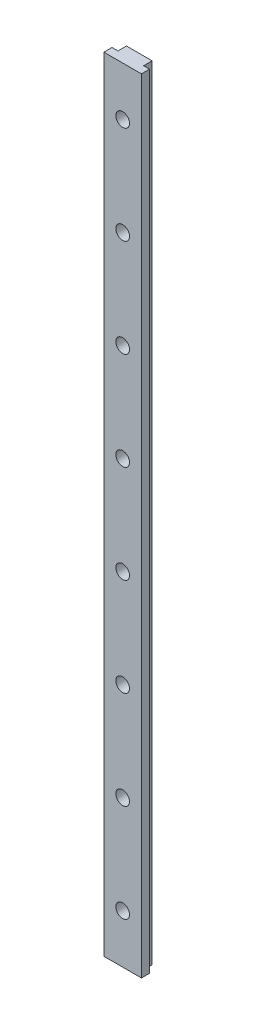
ISO-10303-21;
HEADER;
FILE_DESCRIPTION(('STEP AP214'),'2;1');
FILE_NAME('part.step','',(''),(''),'','','');
FILE_SCHEMA(('AUTOMOTIVE_DESIGN { 1 0 10303 214 1 1 1 1 }'));
ENDSEC;
DATA;
#1=APPLICATION_CONTEXT('core data for automotive mechanical design processes');
#2=APPLICATION_PROTOCOL_DEFINITION('international standard','automotive_design',2000,#1);
#3=PRODUCT_CONTEXT('',#1,'mechanical');
#4=PRODUCT('Part','Part','',(#3));
#5=PRODUCT_RELATED_PRODUCT_CATEGORY('part','',(#4));
#6=PRODUCT_DEFINITION_FORMATION('','',#4);
#7=PRODUCT_DEFINITION_CONTEXT('part definition',#1,'design');
#8=PRODUCT_DEFINITION('design','',#6,#7);
#9=PRODUCT_DEFINITION_SHAPE('','',#8);
#10=(LENGTH_UNIT() NAMED_UNIT(*) SI_UNIT(.MILLI.,.METRE.));
#11=(NAMED_UNIT(*) PLANE_ANGLE_UNIT() SI_UNIT($,.RADIAN.));
#12=(NAMED_UNIT(*) SI_UNIT($,.STERADIAN.) SOLID_ANGLE_UNIT());
#13=UNCERTAINTY_MEASURE_WITH_UNIT(LENGTH_MEASURE(1.E-05),#10,'distance_accuracy_value','');
#14=(GEOMETRIC_REPRESENTATION_CONTEXT(3) GLOBAL_UNCERTAINTY_ASSIGNED_CONTEXT((#13)) GLOBAL_UNIT_ASSIGNED_CONTEXT((#10,
#11,#12)) REPRESENTATION_CONTEXT('',''));
#15=CARTESIAN_POINT('',(0.,0.,0.));
#16=DIRECTION('',(0.,0.,1.));
#17=DIRECTION('',(1.,0.,0.));
#18=AXIS2_PLACEMENT_3D('',#15,#16,#17);
#19=CARTESIAN_POINT('',(-1.6637,101.6,0.));
#20=DIRECTION('',(-1.,0.,0.));
#21=DIRECTION('',(0.,0.,1.));
#22=AXIS2_PLACEMENT_3D('',#19,#20,#21);
#23=PLANE('',#22);
#24=DIRECTION('',(0.,0.,-1.));
#25=VECTOR('',#24,1.);
#26=CARTESIAN_POINT('',(-1.6637,0.,0.));
#27=LINE('',#26,#25);
#28=CARTESIAN_POINT('',(-1.6637,0.,-1.0541));
#29=VERTEX_POINT('',#28);
#30=CARTESIAN_POINT('',(-1.6637,0.,-2.159));
#31=VERTEX_POINT('',#30);
#32=EDGE_CURVE('E127',#29,#31,#27,.T.);
#33=ORIENTED_EDGE('',*,*,#32,.F.);
#34=DIRECTION('',(0.,-1.,0.));
#35=VECTOR('',#34,1.);
#36=CARTESIAN_POINT('',(-1.6637,101.6,-1.0541));
#37=LINE('',#36,#35);
#38=CARTESIAN_POINT('',(-1.6637,101.6,-1.0541));
#39=VERTEX_POINT('',#38);
#40=EDGE_CURVE('E11',#39,#29,#37,.T.);
#41=ORIENTED_EDGE('',*,*,#40,.F.);
#42=DIRECTION('',(0.,0.,-1.));
#43=VECTOR('',#42,1.);
#44=CARTESIAN_POINT('',(-1.6637,101.6,0.));
#45=LINE('',#44,#43);
#46=CARTESIAN_POINT('',(-1.6637,101.6,-2.159));
#47=VERTEX_POINT('',#46);
#48=EDGE_CURVE('E147',#39,#47,#45,.T.);
#49=ORIENTED_EDGE('',*,*,#48,.T.);
#50=DIRECTION('',(0.,-1.,0.));
#51=VECTOR('',#50,1.);
#52=CARTESIAN_POINT('',(-1.6637,101.6,-2.159));
#53=LINE('',#52,#51);
#54=EDGE_CURVE('E49',#47,#31,#53,.T.);
#55=ORIENTED_EDGE('',*,*,#54,.T.);
#56=EDGE_LOOP('',(#33,#41,#49,#55));
#57=FACE_BOUND('',#56,.T.);
#58=ADVANCED_FACE('F33',(#57),#23,.T.);
#59=CARTESIAN_POINT('',(0.,101.6,-1.0541));
#60=DIRECTION('',(0.,0.,-1.));
#61=DIRECTION('',(-1.,0.,0.));
#62=AXIS2_PLACEMENT_3D('',#59,#60,#61);
#63=PLANE('',#62);
#64=DIRECTION('',(1.,0.,0.));
#65=VECTOR('',#64,1.);
#66=CARTESIAN_POINT('',(0.,0.,-1.0541));
#67=LINE('',#66,#65);
#68=CARTESIAN_POINT('',(-2.4384,0.,-1.0541));
#69=VERTEX_POINT('',#68);
#70=EDGE_CURVE('E129',#69,#29,#67,.T.);
#71=ORIENTED_EDGE('',*,*,#70,.F.);
#72=DIRECTION('',(0.,-1.,0.));
#73=VECTOR('',#72,1.);
#74=CARTESIAN_POINT('',(-2.4384,101.6,-1.0541));
#75=LINE('',#74,#73);
#76=CARTESIAN_POINT('',(-2.4384,101.6,-1.0541));
#77=VERTEX_POINT('',#76);
#78=EDGE_CURVE('E41',#77,#69,#75,.T.);
#79=ORIENTED_EDGE('',*,*,#78,.F.);
#80=DIRECTION('',(1.,0.,0.));
#81=VECTOR('',#80,1.);
#82=CARTESIAN_POINT('',(0.,101.6,-1.0541));
#83=LINE('',#82,#81);
#84=EDGE_CURVE('E376',#77,#39,#83,.T.);
#85=ORIENTED_EDGE('',*,*,#84,.T.);
#86=ORIENTED_EDGE('',*,*,#40,.T.);
#87=EDGE_LOOP('',(#71,#79,#85,#86));
#88=FACE_BOUND('',#87,.T.);
#89=ADVANCED_FACE('F165',(#88),#63,.T.);
#90=CARTESIAN_POINT('',(-2.4384,101.6,0.));
#91=DIRECTION('',(-1.,0.,0.));
#92=DIRECTION('',(0.,0.,1.));
#93=AXIS2_PLACEMENT_3D('',#90,#91,#92);
#94=PLANE('',#93);
#95=DIRECTION('',(0.,0.,-1.));
#96=VECTOR('',#95,1.);
#97=CARTESIAN_POINT('',(-2.4384,0.,0.));
#98=LINE('',#97,#96);
#99=CARTESIAN_POINT('',(-2.4384,0.,0.));
#100=VERTEX_POINT('',#99);
#101=EDGE_CURVE('E133',#100,#69,#98,.T.);
#102=ORIENTED_EDGE('',*,*,#101,.F.);
#103=DIRECTION('',(0.,-1.,0.));
#104=VECTOR('',#103,1.);
#105=CARTESIAN_POINT('',(-2.4384,101.6,0.));
#106=LINE('',#105,#104);
#107=CARTESIAN_POINT('',(-2.4384,101.6,0.));
#108=VERTEX_POINT('',#107);
#109=EDGE_CURVE('E154',#108,#100,#106,.T.);
#110=ORIENTED_EDGE('',*,*,#109,.F.);
#111=DIRECTION('',(0.,0.,-1.));
#112=VECTOR('',#111,1.);
#113=CARTESIAN_POINT('',(-2.4384,101.6,0.));
#114=LINE('',#113,#112);
#115=EDGE_CURVE('E161',#108,#77,#114,.T.);
#116=ORIENTED_EDGE('',*,*,#115,.T.);
#117=ORIENTED_EDGE('',*,*,#78,.T.);
#118=EDGE_LOOP('',(#102,#110,#116,#117));
#119=FACE_BOUND('',#118,.T.);
#120=ADVANCED_FACE('F159',(#119),#94,.T.);
#121=CARTESIAN_POINT('',(0.,101.6,0.));
#122=DIRECTION('',(0.,0.,-1.));
#123=DIRECTION('',(-1.,0.,0.));
#124=AXIS2_PLACEMENT_3D('',#121,#122,#123);
#125=PLANE('',#124);
#126=CARTESIAN_POINT('',(0.,6.35,0.));
#127=DIRECTION('',(0.,0.,-1.));
#128=DIRECTION('',(-1.,0.,0.));
#129=AXIS2_PLACEMENT_3D('',#126,#127,#128);
#130=CIRCLE('',#129,0.889);
#131=CARTESIAN_POINT('',(-0.889000000000012,6.35,0.));
#132=VERTEX_POINT('',#131);
#133=EDGE_CURVE('E130',#132,#132,#130,.F.);
#134=ORIENTED_EDGE('',*,*,#133,.F.);
#135=EDGE_LOOP('',(#134));
#136=FACE_BOUND('',#135,.T.);
#137=CARTESIAN_POINT('',(0.,19.05,0.));
#138=DIRECTION('',(0.,0.,-1.));
#139=DIRECTION('',(-1.,0.,0.));
#140=AXIS2_PLACEMENT_3D('',#137,#138,#139);
#141=CIRCLE('',#140,0.889);
#142=CARTESIAN_POINT('',(-0.889000000000012,19.05,0.));
#143=VERTEX_POINT('',#142);
#144=EDGE_CURVE('E331',#143,#143,#141,.F.);
#145=ORIENTED_EDGE('',*,*,#144,.F.);
#146=EDGE_LOOP('',(#145));
#147=FACE_BOUND('',#146,.T.);
#148=CARTESIAN_POINT('',(0.,31.75,0.));
#149=DIRECTION('',(0.,0.,-1.));
#150=DIRECTION('',(-1.,0.,0.));
#151=AXIS2_PLACEMENT_3D('',#148,#149,#150);
#152=CIRCLE('',#151,0.888999999999999);
#153=CARTESIAN_POINT('',(-0.889000000000011,31.75,0.));
#154=VERTEX_POINT('',#153);
#155=EDGE_CURVE('E337',#154,#154,#152,.F.);
#156=ORIENTED_EDGE('',*,*,#155,.F.);
#157=EDGE_LOOP('',(#156));
#158=FACE_BOUND('',#157,.T.);
#159=CARTESIAN_POINT('',(0.,44.45,0.));
#160=DIRECTION('',(0.,0.,-1.));
#161=DIRECTION('',(-1.,0.,0.));
#162=AXIS2_PLACEMENT_3D('',#159,#160,#161);
#163=CIRCLE('',#162,0.888999999999999);
#164=CARTESIAN_POINT('',(-0.889000000000011,44.45,0.));
#165=VERTEX_POINT('',#164);
#166=EDGE_CURVE('E343',#165,#165,#163,.F.);
#167=ORIENTED_EDGE('',*,*,#166,.F.);
#168=EDGE_LOOP('',(#167));
#169=FACE_BOUND('',#168,.T.);
#170=CARTESIAN_POINT('',(0.,57.15,0.));
#171=DIRECTION('',(0.,0.,-1.));
#172=DIRECTION('',(-1.,0.,0.));
#173=AXIS2_PLACEMENT_3D('',#170,#171,#172);
#174=CIRCLE('',#173,0.888999999999999);
#175=CARTESIAN_POINT('',(-0.889000000000011,57.15,0.));
#176=VERTEX_POINT('',#175);
#177=EDGE_CURVE('E349',#176,#176,#174,.F.);
#178=ORIENTED_EDGE('',*,*,#177,.F.);
#179=EDGE_LOOP('',(#178));
#180=FACE_BOUND('',#179,.T.);
#181=CARTESIAN_POINT('',(0.,69.85,0.));
#182=DIRECTION('',(0.,0.,-1.));
#183=DIRECTION('',(-1.,0.,0.));
#184=AXIS2_PLACEMENT_3D('',#181,#182,#183);
#185=CIRCLE('',#184,0.889000000000003);
#186=CARTESIAN_POINT('',(-0.889000000000015,69.85,0.));
#187=VERTEX_POINT('',#186);
#188=EDGE_CURVE('E355',#187,#187,#185,.F.);
#189=ORIENTED_EDGE('',*,*,#188,.F.);
#190=EDGE_LOOP('',(#189));
#191=FACE_BOUND('',#190,.T.);
#192=CARTESIAN_POINT('',(0.,82.55,0.));
#193=DIRECTION('',(0.,0.,-1.));
#194=DIRECTION('',(-1.,0.,0.));
#195=AXIS2_PLACEMENT_3D('',#192,#193,#194);
#196=CIRCLE('',#195,0.889000000000003);
#197=CARTESIAN_POINT('',(-0.889000000000015,82.55,0.));
#198=VERTEX_POINT('',#197);
#199=EDGE_CURVE('E361',#198,#198,#196,.F.);
#200=ORIENTED_EDGE('',*,*,#199,.F.);
#201=EDGE_LOOP('',(#200));
#202=FACE_BOUND('',#201,.T.);
#203=CARTESIAN_POINT('',(0.,95.25,0.));
#204=DIRECTION('',(0.,0.,-1.));
#205=DIRECTION('',(-1.,0.,0.));
#206=AXIS2_PLACEMENT_3D('',#203,#204,#205);
#207=CIRCLE('',#206,0.889000000000003);
#208=CARTESIAN_POINT('',(-0.889000000000015,95.25,0.));
#209=VERTEX_POINT('',#208);
#210=EDGE_CURVE('E367',#209,#209,#207,.F.);
#211=ORIENTED_EDGE('',*,*,#210,.F.);
#212=EDGE_LOOP('',(#211));
#213=FACE_BOUND('',#212,.T.);
#214=DIRECTION('',(1.,0.,0.));
#215=VECTOR('',#214,1.);
#216=CARTESIAN_POINT('',(0.,0.,0.));
#217=LINE('',#216,#215);
#218=CARTESIAN_POINT('',(2.4384,0.,0.));
#219=VERTEX_POINT('',#218);
#220=EDGE_CURVE('E136',#100,#219,#217,.T.);
#221=ORIENTED_EDGE('',*,*,#220,.T.);
#222=DIRECTION('',(0.,-1.,0.));
#223=VECTOR('',#222,1.);
#224=CARTESIAN_POINT('',(2.4384,101.6,0.));
#225=LINE('',#224,#223);
#226=CARTESIAN_POINT('',(2.4384,101.6,0.));
#227=VERTEX_POINT('',#226);
#228=EDGE_CURVE('E151',#227,#219,#225,.T.);
#229=ORIENTED_EDGE('',*,*,#228,.F.);
#230=DIRECTION('',(1.,0.,0.));
#231=VECTOR('',#230,1.);
#232=CARTESIAN_POINT('',(0.,101.6,0.));
#233=LINE('',#232,#231);
#234=EDGE_CURVE('E122',#108,#227,#233,.T.);
#235=ORIENTED_EDGE('',*,*,#234,.F.);
#236=ORIENTED_EDGE('',*,*,#109,.T.);
#237=EDGE_LOOP('',(#221,#229,#235,#236));
#238=FACE_BOUND('',#237,.T.);
#239=ADVANCED_FACE('F172',(#136,#147,#158,#169,#180,#191,#202,#213,#238),#125,.F.);
#240=CARTESIAN_POINT('',(2.4384,101.6,0.));
#241=DIRECTION('',(-1.,0.,0.));
#242=DIRECTION('',(0.,0.,1.));
#243=AXIS2_PLACEMENT_3D('',#240,#241,#242);
#244=PLANE('',#243);
#245=DIRECTION('',(0.,0.,-1.));
#246=VECTOR('',#245,1.);
#247=CARTESIAN_POINT('',(2.4384,0.,0.));
#248=LINE('',#247,#246);
#249=CARTESIAN_POINT('',(2.4384,0.,-1.0541));
#250=VERTEX_POINT('',#249);
#251=EDGE_CURVE('E138',#219,#250,#248,.T.);
#252=ORIENTED_EDGE('',*,*,#251,.T.);
#253=DIRECTION('',(0.,-1.,0.));
#254=VECTOR('',#253,1.);
#255=CARTESIAN_POINT('',(2.4384,101.6,-1.0541));
#256=LINE('',#255,#254);
#257=CARTESIAN_POINT('',(2.4384,101.6,-1.0541));
#258=VERTEX_POINT('',#257);
#259=EDGE_CURVE('E109',#258,#250,#256,.T.);
#260=ORIENTED_EDGE('',*,*,#259,.F.);
#261=DIRECTION('',(0.,0.,-1.));
#262=VECTOR('',#261,1.);
#263=CARTESIAN_POINT('',(2.4384,101.6,0.));
#264=LINE('',#263,#262);
#265=EDGE_CURVE('E119',#227,#258,#264,.T.);
#266=ORIENTED_EDGE('',*,*,#265,.F.);
#267=ORIENTED_EDGE('',*,*,#228,.T.);
#268=EDGE_LOOP('',(#252,#260,#266,#267));
#269=FACE_BOUND('',#268,.T.);
#270=ADVANCED_FACE('F175',(#269),#244,.F.);
#271=CARTESIAN_POINT('',(0.,101.6,-1.0541));
#272=DIRECTION('',(0.,0.,-1.));
#273=DIRECTION('',(-1.,0.,0.));
#274=AXIS2_PLACEMENT_3D('',#271,#272,#273);
#275=PLANE('',#274);
#276=DIRECTION('',(1.,0.,0.));
#277=VECTOR('',#276,1.);
#278=CARTESIAN_POINT('',(0.,0.,-1.0541));
#279=LINE('',#278,#277);
#280=CARTESIAN_POINT('',(1.6637,0.,-1.0541));
#281=VERTEX_POINT('',#280);
#282=EDGE_CURVE('E106',#281,#250,#279,.T.);
#283=ORIENTED_EDGE('',*,*,#282,.F.);
#284=DIRECTION('',(0.,-1.,0.));
#285=VECTOR('',#284,1.);
#286=CARTESIAN_POINT('',(1.6637,101.6,-1.0541));
#287=LINE('',#286,#285);
#288=CARTESIAN_POINT('',(1.6637,101.6,-1.0541));
#289=VERTEX_POINT('',#288);
#290=EDGE_CURVE('E100',#289,#281,#287,.T.);
#291=ORIENTED_EDGE('',*,*,#290,.F.);
#292=DIRECTION('',(1.,0.,0.));
#293=VECTOR('',#292,1.);
#294=CARTESIAN_POINT('',(0.,101.6,-1.0541));
#295=LINE('',#294,#293);
#296=EDGE_CURVE('E104',#289,#258,#295,.T.);
#297=ORIENTED_EDGE('',*,*,#296,.T.);
#298=ORIENTED_EDGE('',*,*,#259,.T.);
#299=EDGE_LOOP('',(#283,#291,#297,#298));
#300=FACE_BOUND('',#299,.T.);
#301=ADVANCED_FACE('F102',(#300),#275,.T.);
#302=CARTESIAN_POINT('',(1.6637,101.6,0.));
#303=DIRECTION('',(-1.,0.,0.));
#304=DIRECTION('',(0.,0.,1.));
#305=AXIS2_PLACEMENT_3D('',#302,#303,#304);
#306=PLANE('',#305);
#307=DIRECTION('',(0.,0.,-1.));
#308=VECTOR('',#307,1.);
#309=CARTESIAN_POINT('',(1.6637,0.,0.));
#310=LINE('',#309,#308);
#311=CARTESIAN_POINT('',(1.6637,0.,-2.159));
#312=VERTEX_POINT('',#311);
#313=EDGE_CURVE('E142',#281,#312,#310,.T.);
#314=ORIENTED_EDGE('',*,*,#313,.T.);
#315=DIRECTION('',(0.,-1.,0.));
#316=VECTOR('',#315,1.);
#317=CARTESIAN_POINT('',(1.6637,101.6,-2.159));
#318=LINE('',#317,#316);
#319=CARTESIAN_POINT('',(1.6637,101.6,-2.159));
#320=VERTEX_POINT('',#319);
#321=EDGE_CURVE('E75',#320,#312,#318,.T.);
#322=ORIENTED_EDGE('',*,*,#321,.F.);
#323=DIRECTION('',(0.,0.,-1.));
#324=VECTOR('',#323,1.);
#325=CARTESIAN_POINT('',(1.6637,101.6,0.));
#326=LINE('',#325,#324);
#327=EDGE_CURVE('E111',#289,#320,#326,.T.);
#328=ORIENTED_EDGE('',*,*,#327,.F.);
#329=ORIENTED_EDGE('',*,*,#290,.T.);
#330=EDGE_LOOP('',(#314,#322,#328,#329));
#331=FACE_BOUND('',#330,.T.);
#332=ADVANCED_FACE('F112',(#331),#306,.F.);
#333=CARTESIAN_POINT('',(0.,101.6,-2.159));
#334=DIRECTION('',(0.,0.,-1.));
#335=DIRECTION('',(-1.,0.,0.));
#336=AXIS2_PLACEMENT_3D('',#333,#334,#335);
#337=PLANE('',#336);
#338=CARTESIAN_POINT('',(0.,6.35,-2.159));
#339=DIRECTION('',(0.,0.,-1.));
#340=DIRECTION('',(-1.,0.,0.));
#341=AXIS2_PLACEMENT_3D('',#338,#339,#340);
#342=CIRCLE('',#341,0.889);
#343=CARTESIAN_POINT('',(-0.889000000000012,6.35,-2.159));
#344=VERTEX_POINT('',#343);
#345=EDGE_CURVE('E327',#344,#344,#342,.T.);
#346=ORIENTED_EDGE('',*,*,#345,.F.);
#347=EDGE_LOOP('',(#346));
#348=FACE_BOUND('',#347,.T.);
#349=CARTESIAN_POINT('',(0.,19.05,-2.159));
#350=DIRECTION('',(0.,0.,-1.));
#351=DIRECTION('',(-1.,0.,0.));
#352=AXIS2_PLACEMENT_3D('',#349,#350,#351);
#353=CIRCLE('',#352,0.889);
#354=CARTESIAN_POINT('',(-0.889000000000012,19.05,-2.159));
#355=VERTEX_POINT('',#354);
#356=EDGE_CURVE('E334',#355,#355,#353,.T.);
#357=ORIENTED_EDGE('',*,*,#356,.F.);
#358=EDGE_LOOP('',(#357));
#359=FACE_BOUND('',#358,.T.);
#360=CARTESIAN_POINT('',(0.,31.75,-2.159));
#361=DIRECTION('',(0.,0.,-1.));
#362=DIRECTION('',(-1.,0.,0.));
#363=AXIS2_PLACEMENT_3D('',#360,#361,#362);
#364=CIRCLE('',#363,0.888999999999999);
#365=CARTESIAN_POINT('',(-0.889000000000011,31.75,-2.159));
#366=VERTEX_POINT('',#365);
#367=EDGE_CURVE('E340',#366,#366,#364,.T.);
#368=ORIENTED_EDGE('',*,*,#367,.F.);
#369=EDGE_LOOP('',(#368));
#370=FACE_BOUND('',#369,.T.);
#371=CARTESIAN_POINT('',(0.,44.45,-2.159));
#372=DIRECTION('',(0.,0.,-1.));
#373=DIRECTION('',(-1.,0.,0.));
#374=AXIS2_PLACEMENT_3D('',#371,#372,#373);
#375=CIRCLE('',#374,0.888999999999999);
#376=CARTESIAN_POINT('',(-0.889000000000011,44.45,-2.159));
#377=VERTEX_POINT('',#376);
#378=EDGE_CURVE('E346',#377,#377,#375,.T.);
#379=ORIENTED_EDGE('',*,*,#378,.F.);
#380=EDGE_LOOP('',(#379));
#381=FACE_BOUND('',#380,.T.);
#382=CARTESIAN_POINT('',(0.,57.15,-2.159));
#383=DIRECTION('',(0.,0.,-1.));
#384=DIRECTION('',(-1.,0.,0.));
#385=AXIS2_PLACEMENT_3D('',#382,#383,#384);
#386=CIRCLE('',#385,0.888999999999999);
#387=CARTESIAN_POINT('',(-0.889000000000011,57.15,-2.159));
#388=VERTEX_POINT('',#387);
#389=EDGE_CURVE('E352',#388,#388,#386,.T.);
#390=ORIENTED_EDGE('',*,*,#389,.F.);
#391=EDGE_LOOP('',(#390));
#392=FACE_BOUND('',#391,.T.);
#393=CARTESIAN_POINT('',(0.,69.85,-2.159));
#394=DIRECTION('',(0.,0.,-1.));
#395=DIRECTION('',(-1.,0.,0.));
#396=AXIS2_PLACEMENT_3D('',#393,#394,#395);
#397=CIRCLE('',#396,0.889000000000003);
#398=CARTESIAN_POINT('',(-0.889000000000015,69.85,-2.159));
#399=VERTEX_POINT('',#398);
#400=EDGE_CURVE('E358',#399,#399,#397,.T.);
#401=ORIENTED_EDGE('',*,*,#400,.F.);
#402=EDGE_LOOP('',(#401));
#403=FACE_BOUND('',#402,.T.);
#404=CARTESIAN_POINT('',(0.,82.55,-2.159));
#405=DIRECTION('',(0.,0.,-1.));
#406=DIRECTION('',(-1.,0.,0.));
#407=AXIS2_PLACEMENT_3D('',#404,#405,#406);
#408=CIRCLE('',#407,0.889000000000003);
#409=CARTESIAN_POINT('',(-0.889000000000015,82.55,-2.159));
#410=VERTEX_POINT('',#409);
#411=EDGE_CURVE('E364',#410,#410,#408,.T.);
#412=ORIENTED_EDGE('',*,*,#411,.F.);
#413=EDGE_LOOP('',(#412));
#414=FACE_BOUND('',#413,.T.);
#415=CARTESIAN_POINT('',(0.,95.25,-2.159));
#416=DIRECTION('',(0.,0.,-1.));
#417=DIRECTION('',(-1.,0.,0.));
#418=AXIS2_PLACEMENT_3D('',#415,#416,#417);
#419=CIRCLE('',#418,0.889000000000003);
#420=CARTESIAN_POINT('',(-0.889000000000015,95.25,-2.159));
#421=VERTEX_POINT('',#420);
#422=EDGE_CURVE('E370',#421,#421,#419,.T.);
#423=ORIENTED_EDGE('',*,*,#422,.F.);
#424=EDGE_LOOP('',(#423));
#425=FACE_BOUND('',#424,.T.);
#426=DIRECTION('',(1.,0.,0.));
#427=VECTOR('',#426,1.);
#428=CARTESIAN_POINT('',(0.,0.,-2.159));
#429=LINE('',#428,#427);
#430=EDGE_CURVE('E144',#31,#312,#429,.T.);
#431=ORIENTED_EDGE('',*,*,#430,.F.);
#432=ORIENTED_EDGE('',*,*,#54,.F.);
#433=DIRECTION('',(1.,0.,0.));
#434=VECTOR('',#433,1.);
#435=CARTESIAN_POINT('',(0.,101.6,-2.159));
#436=LINE('',#435,#434);
#437=EDGE_CURVE('E115',#47,#320,#436,.T.);
#438=ORIENTED_EDGE('',*,*,#437,.T.);
#439=ORIENTED_EDGE('',*,*,#321,.T.);
#440=EDGE_LOOP('',(#431,#432,#438,#439));
#441=FACE_BOUND('',#440,.T.);
#442=ADVANCED_FACE('F176',(#348,#359,#370,#381,#392,#403,#414,#425,#441),#337,.T.);
#443=CARTESIAN_POINT('',(0.,101.6,0.));
#444=DIRECTION('',(0.,1.,0.));
#445=DIRECTION('',(0.,0.,1.));
#446=AXIS2_PLACEMENT_3D('',#443,#444,#445);
#447=PLANE('',#446);
#448=ORIENTED_EDGE('',*,*,#48,.F.);
#449=ORIENTED_EDGE('',*,*,#84,.F.);
#450=ORIENTED_EDGE('',*,*,#115,.F.);
#451=ORIENTED_EDGE('',*,*,#234,.T.);
#452=ORIENTED_EDGE('',*,*,#265,.T.);
#453=ORIENTED_EDGE('',*,*,#296,.F.);
#454=ORIENTED_EDGE('',*,*,#327,.T.);
#455=ORIENTED_EDGE('',*,*,#437,.F.);
#456=EDGE_LOOP('',(#448,#449,#450,#451,#452,#453,#454,#455));
#457=FACE_BOUND('',#456,.T.);
#458=ADVANCED_FACE('F117',(#457),#447,.T.);
#459=CARTESIAN_POINT('',(0.,0.,0.));
#460=DIRECTION('',(0.,1.,0.));
#461=DIRECTION('',(0.,0.,1.));
#462=AXIS2_PLACEMENT_3D('',#459,#460,#461);
#463=PLANE('',#462);
#464=ORIENTED_EDGE('',*,*,#32,.T.);
#465=ORIENTED_EDGE('',*,*,#430,.T.);
#466=ORIENTED_EDGE('',*,*,#313,.F.);
#467=ORIENTED_EDGE('',*,*,#282,.T.);
#468=ORIENTED_EDGE('',*,*,#251,.F.);
#469=ORIENTED_EDGE('',*,*,#220,.F.);
#470=ORIENTED_EDGE('',*,*,#101,.T.);
#471=ORIENTED_EDGE('',*,*,#70,.T.);
#472=EDGE_LOOP('',(#464,#465,#466,#467,#468,#469,#470,#471));
#473=FACE_BOUND('',#472,.T.);
#474=ADVANCED_FACE('F168',(#473),#463,.F.);
#475=CARTESIAN_POINT('',(0.,95.25,0.00100000000000013));
#476=DIRECTION('',(0.,0.,-1.));
#477=DIRECTION('',(-1.,0.,0.));
#478=AXIS2_PLACEMENT_3D('',#475,#476,#477);
#479=CYLINDRICAL_SURFACE('',#478,0.889000000000003);
#480=ORIENTED_EDGE('',*,*,#422,.T.);
#481=EDGE_LOOP('',(#480));
#482=FACE_BOUND('',#481,.T.);
#483=ORIENTED_EDGE('',*,*,#210,.T.);
#484=EDGE_LOOP('',(#483));
#485=FACE_BOUND('',#484,.T.);
#486=ADVANCED_FACE('F230',(#482,#485),#479,.F.);
#487=CARTESIAN_POINT('',(0.,82.55,0.00100000000000013));
#488=DIRECTION('',(0.,0.,-1.));
#489=DIRECTION('',(-1.,0.,0.));
#490=AXIS2_PLACEMENT_3D('',#487,#488,#489);
#491=CYLINDRICAL_SURFACE('',#490,0.889000000000003);
#492=ORIENTED_EDGE('',*,*,#411,.T.);
#493=EDGE_LOOP('',(#492));
#494=FACE_BOUND('',#493,.T.);
#495=ORIENTED_EDGE('',*,*,#199,.T.);
#496=EDGE_LOOP('',(#495));
#497=FACE_BOUND('',#496,.T.);
#498=ADVANCED_FACE('F251',(#494,#497),#491,.F.);
#499=CARTESIAN_POINT('',(0.,69.85,0.00100000000000013));
#500=DIRECTION('',(0.,0.,-1.));
#501=DIRECTION('',(-1.,0.,0.));
#502=AXIS2_PLACEMENT_3D('',#499,#500,#501);
#503=CYLINDRICAL_SURFACE('',#502,0.889000000000003);
#504=ORIENTED_EDGE('',*,*,#400,.T.);
#505=EDGE_LOOP('',(#504));
#506=FACE_BOUND('',#505,.T.);
#507=ORIENTED_EDGE('',*,*,#188,.T.);
#508=EDGE_LOOP('',(#507));
#509=FACE_BOUND('',#508,.T.);
#510=ADVANCED_FACE('F261',(#506,#509),#503,.F.);
#511=CARTESIAN_POINT('',(0.,57.15,0.00100000000000013));
#512=DIRECTION('',(0.,0.,-1.));
#513=DIRECTION('',(-1.,0.,0.));
#514=AXIS2_PLACEMENT_3D('',#511,#512,#513);
#515=CYLINDRICAL_SURFACE('',#514,0.888999999999999);
#516=ORIENTED_EDGE('',*,*,#389,.T.);
#517=EDGE_LOOP('',(#516));
#518=FACE_BOUND('',#517,.T.);
#519=ORIENTED_EDGE('',*,*,#177,.T.);
#520=EDGE_LOOP('',(#519));
#521=FACE_BOUND('',#520,.T.);
#522=ADVANCED_FACE('F271',(#518,#521),#515,.F.);
#523=CARTESIAN_POINT('',(0.,44.45,0.00100000000000013));
#524=DIRECTION('',(0.,0.,-1.));
#525=DIRECTION('',(-1.,0.,0.));
#526=AXIS2_PLACEMENT_3D('',#523,#524,#525);
#527=CYLINDRICAL_SURFACE('',#526,0.888999999999999);
#528=ORIENTED_EDGE('',*,*,#378,.T.);
#529=EDGE_LOOP('',(#528));
#530=FACE_BOUND('',#529,.T.);
#531=ORIENTED_EDGE('',*,*,#166,.T.);
#532=EDGE_LOOP('',(#531));
#533=FACE_BOUND('',#532,.T.);
#534=ADVANCED_FACE('F281',(#530,#533),#527,.F.);
#535=CARTESIAN_POINT('',(0.,31.75,0.00100000000000013));
#536=DIRECTION('',(0.,0.,-1.));
#537=DIRECTION('',(-1.,0.,0.));
#538=AXIS2_PLACEMENT_3D('',#535,#536,#537);
#539=CYLINDRICAL_SURFACE('',#538,0.888999999999999);
#540=ORIENTED_EDGE('',*,*,#367,.T.);
#541=EDGE_LOOP('',(#540));
#542=FACE_BOUND('',#541,.T.);
#543=ORIENTED_EDGE('',*,*,#155,.T.);
#544=EDGE_LOOP('',(#543));
#545=FACE_BOUND('',#544,.T.);
#546=ADVANCED_FACE('F291',(#542,#545),#539,.F.);
#547=CARTESIAN_POINT('',(0.,19.05,0.00100000000000013));
#548=DIRECTION('',(0.,0.,-1.));
#549=DIRECTION('',(-1.,0.,0.));
#550=AXIS2_PLACEMENT_3D('',#547,#548,#549);
#551=CYLINDRICAL_SURFACE('',#550,0.889);
#552=ORIENTED_EDGE('',*,*,#356,.T.);
#553=EDGE_LOOP('',(#552));
#554=FACE_BOUND('',#553,.T.);
#555=ORIENTED_EDGE('',*,*,#144,.T.);
#556=EDGE_LOOP('',(#555));
#557=FACE_BOUND('',#556,.T.);
#558=ADVANCED_FACE('F301',(#554,#557),#551,.F.);
#559=CARTESIAN_POINT('',(0.,6.35,0.00100000000000013));
#560=DIRECTION('',(0.,0.,-1.));
#561=DIRECTION('',(-1.,0.,0.));
#562=AXIS2_PLACEMENT_3D('',#559,#560,#561);
#563=CYLINDRICAL_SURFACE('',#562,0.889);
#564=ORIENTED_EDGE('',*,*,#345,.T.);
#565=EDGE_LOOP('',(#564));
#566=FACE_BOUND('',#565,.T.);
#567=ORIENTED_EDGE('',*,*,#133,.T.);
#568=EDGE_LOOP('',(#567));
#569=FACE_BOUND('',#568,.T.);
#570=ADVANCED_FACE('F311',(#566,#569),#563,.F.);
#571=CLOSED_SHELL('',(#58,#89,#120,#239,#270,#301,#332,#442,#458,#474,#486,#498,#510,#522,#534,
#546,#558,#570));
#572=MANIFOLD_SOLID_BREP('B2',#571);
#573=ADVANCED_BREP_SHAPE_REPRESENTATION('',(#18,#572),#14);
#574=SHAPE_DEFINITION_REPRESENTATION(#9,#573);
ENDSEC;
END-ISO-10303-21;
